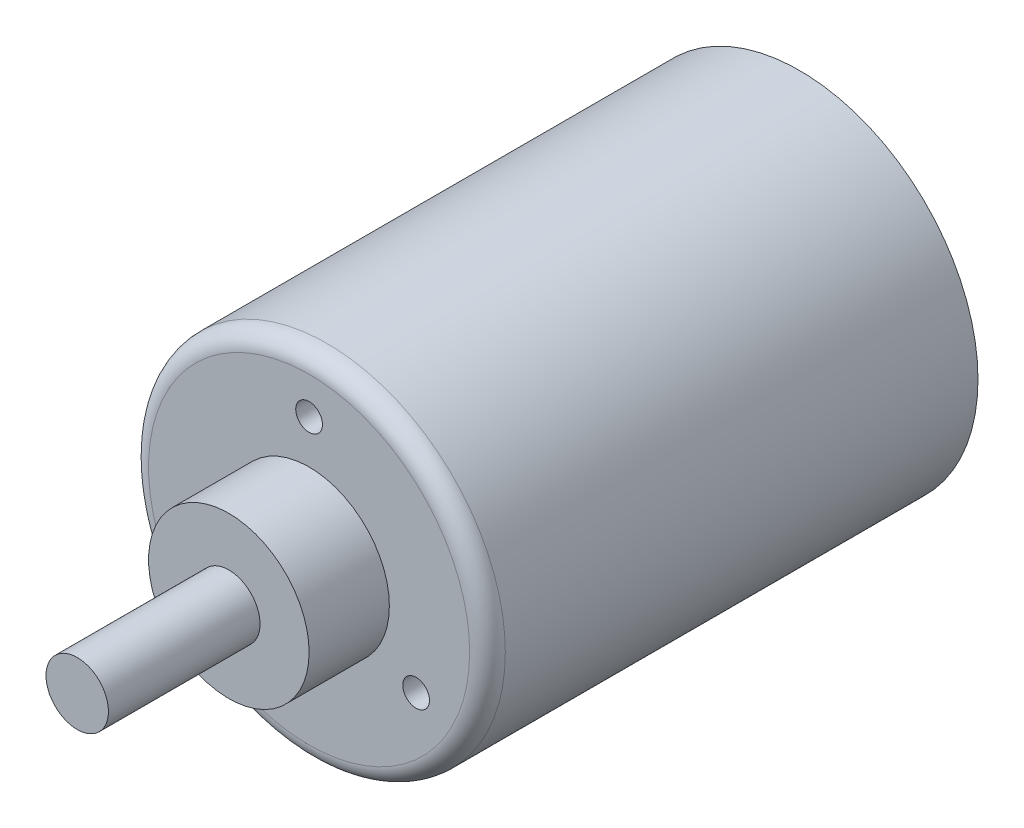
ISO-10303-21;
HEADER;
FILE_DESCRIPTION(('STEP AP214'),'2;1');
FILE_NAME('part.step','',(''),(''),'','','');
FILE_SCHEMA(('AUTOMOTIVE_DESIGN { 1 0 10303 214 1 1 1 1 }'));
ENDSEC;
DATA;
#1=APPLICATION_CONTEXT('core data for automotive mechanical design processes');
#2=APPLICATION_PROTOCOL_DEFINITION('international standard','automotive_design',2000,#1);
#3=PRODUCT_CONTEXT('',#1,'mechanical');
#4=PRODUCT('Part','Part','',(#3));
#5=PRODUCT_RELATED_PRODUCT_CATEGORY('part','',(#4));
#6=PRODUCT_DEFINITION_FORMATION('','',#4);
#7=PRODUCT_DEFINITION_CONTEXT('part definition',#1,'design');
#8=PRODUCT_DEFINITION('design','',#6,#7);
#9=PRODUCT_DEFINITION_SHAPE('','',#8);
#10=(LENGTH_UNIT() NAMED_UNIT(*) SI_UNIT(.MILLI.,.METRE.));
#11=(NAMED_UNIT(*) PLANE_ANGLE_UNIT() SI_UNIT($,.RADIAN.));
#12=(NAMED_UNIT(*) SI_UNIT($,.STERADIAN.) SOLID_ANGLE_UNIT());
#13=UNCERTAINTY_MEASURE_WITH_UNIT(LENGTH_MEASURE(1.E-05),#10,'distance_accuracy_value','');
#14=(GEOMETRIC_REPRESENTATION_CONTEXT(3) GLOBAL_UNCERTAINTY_ASSIGNED_CONTEXT((#13)) GLOBAL_UNIT_ASSIGNED_CONTEXT((#10,
#11,#12)) REPRESENTATION_CONTEXT('',''));
#15=CARTESIAN_POINT('',(0.,0.,0.));
#16=DIRECTION('',(0.,0.,1.));
#17=DIRECTION('',(1.,0.,0.));
#18=AXIS2_PLACEMENT_3D('',#15,#16,#17);
#19=CARTESIAN_POINT('',(0.,0.,55.));
#20=DIRECTION('',(0.,0.,-1.));
#21=DIRECTION('',(-1.,0.,0.));
#22=AXIS2_PLACEMENT_3D('',#19,#20,#21);
#23=CYLINDRICAL_SURFACE('',#22,20.);
#24=CARTESIAN_POINT('',(0.,0.,53.));
#25=DIRECTION('',(0.,0.,1.));
#26=DIRECTION('',(1.,0.,0.));
#27=AXIS2_PLACEMENT_3D('',#24,#25,#26);
#28=CIRCLE('',#27,20.);
#29=CARTESIAN_POINT('',(20.,0.,53.));
#30=VERTEX_POINT('',#29);
#31=EDGE_CURVE('E10',#30,#30,#28,.F.);
#32=ORIENTED_EDGE('',*,*,#31,.T.);
#33=EDGE_LOOP('',(#32));
#34=FACE_BOUND('',#33,.T.);
#35=CARTESIAN_POINT('',(0.,0.,0.));
#36=DIRECTION('',(0.,0.,1.));
#37=DIRECTION('',(1.,0.,0.));
#38=AXIS2_PLACEMENT_3D('',#35,#36,#37);
#39=CIRCLE('',#38,20.);
#40=CARTESIAN_POINT('',(20.,0.,0.));
#41=VERTEX_POINT('',#40);
#42=EDGE_CURVE('E61',#41,#41,#39,.T.);
#43=ORIENTED_EDGE('',*,*,#42,.T.);
#44=EDGE_LOOP('',(#43));
#45=FACE_BOUND('',#44,.T.);
#46=ADVANCED_FACE('F43',(#34,#45),#23,.T.);
#47=CARTESIAN_POINT('',(0.,0.,55.));
#48=DIRECTION('',(0.,0.,1.));
#49=DIRECTION('',(1.,0.,0.));
#50=AXIS2_PLACEMENT_3D('',#47,#48,#49);
#51=PLANE('',#50);
#52=CARTESIAN_POINT('',(0.,13.856406460551,55.));
#53=DIRECTION('',(0.,0.,1.));
#54=DIRECTION('',(1.,0.,0.));
#55=AXIS2_PLACEMENT_3D('',#52,#53,#54);
#56=CIRCLE('',#55,1.5);
#57=CARTESIAN_POINT('',(1.5,13.856406460551,55.));
#58=VERTEX_POINT('',#57);
#59=EDGE_CURVE('E104',#58,#58,#56,.T.);
#60=ORIENTED_EDGE('',*,*,#59,.F.);
#61=EDGE_LOOP('',(#60));
#62=FACE_BOUND('',#61,.T.);
#63=CARTESIAN_POINT('',(-12.,-6.92820323027556,55.));
#64=DIRECTION('',(0.,0.,1.));
#65=DIRECTION('',(1.,0.,0.));
#66=AXIS2_PLACEMENT_3D('',#63,#64,#65);
#67=CIRCLE('',#66,1.5);
#68=CARTESIAN_POINT('',(-10.5,-6.92820323027556,55.));
#69=VERTEX_POINT('',#68);
#70=EDGE_CURVE('E100',#69,#69,#67,.T.);
#71=ORIENTED_EDGE('',*,*,#70,.F.);
#72=EDGE_LOOP('',(#71));
#73=FACE_BOUND('',#72,.T.);
#74=CARTESIAN_POINT('',(12.,-6.92820323027538,55.));
#75=DIRECTION('',(0.,0.,1.));
#76=DIRECTION('',(1.,0.,0.));
#77=AXIS2_PLACEMENT_3D('',#74,#75,#76);
#78=CIRCLE('',#77,1.5);
#79=CARTESIAN_POINT('',(13.5,-6.92820323027538,55.));
#80=VERTEX_POINT('',#79);
#81=EDGE_CURVE('E92',#80,#80,#78,.T.);
#82=ORIENTED_EDGE('',*,*,#81,.F.);
#83=EDGE_LOOP('',(#82));
#84=FACE_BOUND('',#83,.T.);
#85=CARTESIAN_POINT('',(0.,0.,55.));
#86=DIRECTION('',(0.,0.,1.));
#87=DIRECTION('',(1.,0.,0.));
#88=AXIS2_PLACEMENT_3D('',#85,#86,#87);
#89=CIRCLE('',#88,18.);
#90=CARTESIAN_POINT('',(18.,0.,55.));
#91=VERTEX_POINT('',#90);
#92=EDGE_CURVE('E51',#91,#91,#89,.T.);
#93=ORIENTED_EDGE('',*,*,#92,.T.);
#94=EDGE_LOOP('',(#93));
#95=FACE_BOUND('',#94,.T.);
#96=CARTESIAN_POINT('',(0.,0.,55.));
#97=DIRECTION('',(0.,0.,1.));
#98=DIRECTION('',(1.,0.,0.));
#99=AXIS2_PLACEMENT_3D('',#96,#97,#98);
#100=CIRCLE('',#99,9.);
#101=CARTESIAN_POINT('',(9.,0.,55.));
#102=VERTEX_POINT('',#101);
#103=EDGE_CURVE('E56',#102,#102,#100,.T.);
#104=ORIENTED_EDGE('',*,*,#103,.F.);
#105=EDGE_LOOP('',(#104));
#106=FACE_BOUND('',#105,.T.);
#107=ADVANCED_FACE('F121',(#62,#73,#84,#95,#106),#51,.T.);
#108=CARTESIAN_POINT('',(0.,0.,0.));
#109=DIRECTION('',(0.,0.,1.));
#110=DIRECTION('',(1.,0.,0.));
#111=AXIS2_PLACEMENT_3D('',#108,#109,#110);
#112=PLANE('',#111);
#113=CARTESIAN_POINT('',(0.,0.,0.));
#114=DIRECTION('',(0.,0.,-1.));
#115=DIRECTION('',(-1.,0.,0.));
#116=AXIS2_PLACEMENT_3D('',#113,#114,#115);
#117=CIRCLE('',#116,17.);
#118=CARTESIAN_POINT('',(-17.,0.,0.));
#119=VERTEX_POINT('',#118);
#120=EDGE_CURVE('E80',#119,#119,#117,.T.);
#121=ORIENTED_EDGE('',*,*,#120,.F.);
#122=EDGE_LOOP('',(#121));
#123=FACE_BOUND('',#122,.T.);
#124=ORIENTED_EDGE('',*,*,#42,.F.);
#125=EDGE_LOOP('',(#124));
#126=FACE_BOUND('',#125,.T.);
#127=ADVANCED_FACE('F124',(#123,#126),#112,.F.);
#128=CARTESIAN_POINT('',(0.,0.,64.));
#129=DIRECTION('',(0.,0.,-1.));
#130=DIRECTION('',(-1.,0.,0.));
#131=AXIS2_PLACEMENT_3D('',#128,#129,#130);
#132=CYLINDRICAL_SURFACE('',#131,9.);
#133=CARTESIAN_POINT('',(0.,0.,64.));
#134=DIRECTION('',(0.,0.,1.));
#135=DIRECTION('',(1.,0.,0.));
#136=AXIS2_PLACEMENT_3D('',#133,#134,#135);
#137=CIRCLE('',#136,9.);
#138=CARTESIAN_POINT('',(9.,0.,64.));
#139=VERTEX_POINT('',#138);
#140=EDGE_CURVE('E66',#139,#139,#137,.T.);
#141=ORIENTED_EDGE('',*,*,#140,.F.);
#142=EDGE_LOOP('',(#141));
#143=FACE_BOUND('',#142,.T.);
#144=ORIENTED_EDGE('',*,*,#103,.T.);
#145=EDGE_LOOP('',(#144));
#146=FACE_BOUND('',#145,.T.);
#147=ADVANCED_FACE('F132',(#143,#146),#132,.T.);
#148=CARTESIAN_POINT('',(0.,0.,64.));
#149=DIRECTION('',(0.,0.,1.));
#150=DIRECTION('',(1.,0.,0.));
#151=AXIS2_PLACEMENT_3D('',#148,#149,#150);
#152=PLANE('',#151);
#153=CARTESIAN_POINT('',(0.,0.,64.));
#154=DIRECTION('',(0.,0.,1.));
#155=DIRECTION('',(1.,0.,0.));
#156=AXIS2_PLACEMENT_3D('',#153,#154,#155);
#157=CIRCLE('',#156,3.5);
#158=CARTESIAN_POINT('',(-3.5,0.,64.));
#159=VERTEX_POINT('',#158);
#160=EDGE_CURVE('E71',#159,#159,#157,.F.);
#161=ORIENTED_EDGE('',*,*,#160,.T.);
#162=EDGE_LOOP('',(#161));
#163=FACE_BOUND('',#162,.T.);
#164=ORIENTED_EDGE('',*,*,#140,.T.);
#165=EDGE_LOOP('',(#164));
#166=FACE_BOUND('',#165,.T.);
#167=ADVANCED_FACE('F134',(#163,#166),#152,.T.);
#168=CARTESIAN_POINT('',(0.,0.,81.));
#169=DIRECTION('',(0.,0.,-1.));
#170=DIRECTION('',(-1.,0.,0.));
#171=AXIS2_PLACEMENT_3D('',#168,#169,#170);
#172=CYLINDRICAL_SURFACE('',#171,3.5);
#173=CARTESIAN_POINT('',(0.,0.,81.));
#174=DIRECTION('',(0.,0.,1.));
#175=DIRECTION('',(1.,0.,0.));
#176=AXIS2_PLACEMENT_3D('',#173,#174,#175);
#177=CIRCLE('',#176,3.5);
#178=CARTESIAN_POINT('',(-3.5,0.,81.));
#179=VERTEX_POINT('',#178);
#180=EDGE_CURVE('E75',#179,#179,#177,.T.);
#181=CARTESIAN_POINT('',(-3.5,0.,64.));
#182=CARTESIAN_POINT('',(-3.5,0.,64.1770833333333));
#183=CARTESIAN_POINT('',(-3.5,0.,64.3541666666667));
#184=CARTESIAN_POINT('',(-3.5,0.,64.7083333333333));
#185=CARTESIAN_POINT('',(-3.5,0.,64.8854166666667));
#186=CARTESIAN_POINT('',(-3.5,0.,65.2395833333333));
#187=CARTESIAN_POINT('',(-3.5,0.,65.4166666666667));
#188=CARTESIAN_POINT('',(-3.5,0.,65.7708333333333));
#189=CARTESIAN_POINT('',(-3.5,0.,65.9479166666667));
#190=CARTESIAN_POINT('',(-3.5,0.,66.3020833333333));
#191=CARTESIAN_POINT('',(-3.5,0.,66.4791666666667));
#192=CARTESIAN_POINT('',(-3.5,0.,66.8333333333333));
#193=CARTESIAN_POINT('',(-3.5,0.,67.0104166666667));
#194=CARTESIAN_POINT('',(-3.5,0.,67.3645833333333));
#195=CARTESIAN_POINT('',(-3.5,0.,67.5416666666667));
#196=CARTESIAN_POINT('',(-3.5,0.,67.8958333333333));
#197=CARTESIAN_POINT('',(-3.5,0.,68.0729166666667));
#198=CARTESIAN_POINT('',(-3.5,0.,68.4270833333333));
#199=CARTESIAN_POINT('',(-3.5,0.,68.6041666666667));
#200=CARTESIAN_POINT('',(-3.5,0.,68.9583333333333));
#201=CARTESIAN_POINT('',(-3.5,0.,69.1354166666667));
#202=CARTESIAN_POINT('',(-3.5,0.,69.4895833333333));
#203=CARTESIAN_POINT('',(-3.5,0.,69.6666666666667));
#204=CARTESIAN_POINT('',(-3.5,0.,70.0208333333333));
#205=CARTESIAN_POINT('',(-3.5,0.,70.1979166666667));
#206=CARTESIAN_POINT('',(-3.5,0.,70.5520833333333));
#207=CARTESIAN_POINT('',(-3.5,0.,70.7291666666667));
#208=CARTESIAN_POINT('',(-3.5,0.,71.0833333333333));
#209=CARTESIAN_POINT('',(-3.5,0.,71.2604166666667));
#210=CARTESIAN_POINT('',(-3.5,0.,71.6145833333333));
#211=CARTESIAN_POINT('',(-3.5,0.,71.7916666666667));
#212=CARTESIAN_POINT('',(-3.5,0.,72.1458333333333));
#213=CARTESIAN_POINT('',(-3.5,0.,72.3229166666667));
#214=CARTESIAN_POINT('',(-3.5,0.,72.6770833333333));
#215=CARTESIAN_POINT('',(-3.5,0.,72.8541666666667));
#216=CARTESIAN_POINT('',(-3.5,0.,73.2083333333333));
#217=CARTESIAN_POINT('',(-3.5,0.,73.3854166666667));
#218=CARTESIAN_POINT('',(-3.5,0.,73.7395833333333));
#219=CARTESIAN_POINT('',(-3.5,0.,73.9166666666667));
#220=CARTESIAN_POINT('',(-3.5,0.,74.2708333333333));
#221=CARTESIAN_POINT('',(-3.5,0.,74.4479166666667));
#222=CARTESIAN_POINT('',(-3.5,0.,74.8020833333333));
#223=CARTESIAN_POINT('',(-3.5,0.,74.9791666666667));
#224=CARTESIAN_POINT('',(-3.5,0.,75.3333333333333));
#225=CARTESIAN_POINT('',(-3.5,0.,75.5104166666666));
#226=CARTESIAN_POINT('',(-3.5,0.,75.8645833333333));
#227=CARTESIAN_POINT('',(-3.5,0.,76.0416666666667));
#228=CARTESIAN_POINT('',(-3.5,0.,76.3958333333333));
#229=CARTESIAN_POINT('',(-3.5,0.,76.5729166666667));
#230=CARTESIAN_POINT('',(-3.5,0.,76.9270833333333));
#231=CARTESIAN_POINT('',(-3.5,0.,77.1041666666667));
#232=CARTESIAN_POINT('',(-3.5,0.,77.4583333333333));
#233=CARTESIAN_POINT('',(-3.5,0.,77.6354166666667));
#234=CARTESIAN_POINT('',(-3.5,0.,77.9895833333333));
#235=CARTESIAN_POINT('',(-3.5,0.,78.1666666666666));
#236=CARTESIAN_POINT('',(-3.5,0.,78.5208333333333));
#237=CARTESIAN_POINT('',(-3.5,0.,78.6979166666667));
#238=CARTESIAN_POINT('',(-3.5,0.,79.0520833333333));
#239=CARTESIAN_POINT('',(-3.5,0.,79.2291666666667));
#240=CARTESIAN_POINT('',(-3.5,0.,79.5833333333333));
#241=CARTESIAN_POINT('',(-3.5,0.,79.7604166666667));
#242=CARTESIAN_POINT('',(-3.5,0.,80.1145833333333));
#243=CARTESIAN_POINT('',(-3.5,0.,80.2916666666667));
#244=CARTESIAN_POINT('',(-3.5,0.,80.6458333333333));
#245=CARTESIAN_POINT('',(-3.5,0.,80.8229166666666));
#246=CARTESIAN_POINT('',(-3.5,0.,81.));
#247=B_SPLINE_CURVE_WITH_KNOTS('',3,(#181,#182,#183,#184,#185,#186,#187,#188,#189,#190,#191,
#192,#193,#194,#195,#196,#197,#198,#199,#200,#201,#202,#203,#204,#205,#206,#207,#208,#209,#210,
#211,#212,#213,#214,#215,#216,#217,#218,#219,#220,#221,#222,#223,#224,#225,#226,#227,#228,#229,
#230,#231,#232,#233,#234,#235,#236,#237,#238,#239,#240,#241,#242,#243,#244,#245,#246),
.UNSPECIFIED.,.F.,.F.,(4,2,2,2,2,2,2,2,2,2,2,2,2,2,2,2,2,2,2,2,2,2,2,2,2,2,2,2,2,2,2,2,4),(0.,
0.531249999999997,1.06250000000001,1.59375,2.125,2.65625,3.1875,3.71875000000001,4.25,4.78125,
5.3125,5.84374999999999,6.37500000000001,6.90625,7.4375,7.96875,8.49999999999999,
9.03125000000001,9.5625,10.09375,10.625,11.15625,11.6875,12.21875,12.75,13.28125,13.8125,
14.34375,14.875,15.40625,15.9375,16.46875,17.),.UNSPECIFIED.);
#248=EDGE_CURVE('BSEAM140',#159,#179,#247,.T.);
#249=ORIENTED_EDGE('',*,*,#160,.F.);
#250=ORIENTED_EDGE('',*,*,#180,.F.);
#251=ORIENTED_EDGE('',*,*,#248,.T.);
#252=ORIENTED_EDGE('',*,*,#248,.F.);
#253=EDGE_LOOP('',(#249,#251,#250,#252));
#254=FACE_BOUND('',#253,.T.);
#255=ADVANCED_FACE('F140',(#254),#172,.T.);
#256=CARTESIAN_POINT('',(0.,0.,81.));
#257=DIRECTION('',(0.,0.,1.));
#258=DIRECTION('',(1.,0.,0.));
#259=AXIS2_PLACEMENT_3D('',#256,#257,#258);
#260=PLANE('',#259);
#261=ORIENTED_EDGE('',*,*,#180,.T.);
#262=EDGE_LOOP('',(#261));
#263=FACE_BOUND('',#262,.T.);
#264=ADVANCED_FACE('F239',(#263),#260,.T.);
#265=CARTESIAN_POINT('',(0.,0.,3.));
#266=DIRECTION('',(0.,0.,-1.));
#267=DIRECTION('',(-1.,0.,0.));
#268=AXIS2_PLACEMENT_3D('',#265,#266,#267);
#269=CYLINDRICAL_SURFACE('',#268,17.);
#270=CARTESIAN_POINT('',(0.,0.,3.));
#271=DIRECTION('',(0.,0.,-1.));
#272=DIRECTION('',(-1.,0.,0.));
#273=AXIS2_PLACEMENT_3D('',#270,#271,#272);
#274=CIRCLE('',#273,17.);
#275=CARTESIAN_POINT('',(-17.,0.,3.));
#276=VERTEX_POINT('',#275);
#277=EDGE_CURVE('E79',#276,#276,#274,.T.);
#278=ORIENTED_EDGE('',*,*,#277,.F.);
#279=EDGE_LOOP('',(#278));
#280=FACE_BOUND('',#279,.T.);
#281=ORIENTED_EDGE('',*,*,#120,.T.);
#282=EDGE_LOOP('',(#281));
#283=FACE_BOUND('',#282,.T.);
#284=ADVANCED_FACE('F231',(#280,#283),#269,.F.);
#285=CARTESIAN_POINT('',(0.,0.,3.));
#286=DIRECTION('',(0.,0.,-1.));
#287=DIRECTION('',(-1.,0.,0.));
#288=AXIS2_PLACEMENT_3D('',#285,#286,#287);
#289=PLANE('',#288);
#290=ORIENTED_EDGE('',*,*,#277,.T.);
#291=EDGE_LOOP('',(#290));
#292=FACE_BOUND('',#291,.T.);
#293=ADVANCED_FACE('F159',(#292),#289,.T.);
#294=CARTESIAN_POINT('',(0.,0.,53.));
#295=DIRECTION('',(0.,0.,1.));
#296=DIRECTION('',(1.,0.,0.));
#297=AXIS2_PLACEMENT_3D('',#294,#295,#296);
#298=TOROIDAL_SURFACE('',#297,18.,2.);
#299=ORIENTED_EDGE('',*,*,#31,.F.);
#300=EDGE_LOOP('',(#299));
#301=FACE_BOUND('',#300,.T.);
#302=ORIENTED_EDGE('',*,*,#92,.F.);
#303=EDGE_LOOP('',(#302));
#304=FACE_BOUND('',#303,.T.);
#305=ADVANCED_FACE('F45',(#301,#304),#298,.T.);
#306=CARTESIAN_POINT('',(12.,-6.92820323027538,50.));
#307=DIRECTION('',(0.,0.,1.));
#308=DIRECTION('',(1.,0.,0.));
#309=AXIS2_PLACEMENT_3D('',#306,#307,#308);
#310=CYLINDRICAL_SURFACE('',#309,1.5);
#311=CARTESIAN_POINT('',(12.,-6.92820323027538,50.));
#312=DIRECTION('',(0.,0.,1.));
#313=DIRECTION('',(1.,0.,0.));
#314=AXIS2_PLACEMENT_3D('',#311,#312,#313);
#315=CIRCLE('',#314,1.5);
#316=CARTESIAN_POINT('',(13.5,-6.92820323027538,50.));
#317=VERTEX_POINT('',#316);
#318=EDGE_CURVE('E88',#317,#317,#315,.T.);
#319=ORIENTED_EDGE('',*,*,#318,.F.);
#320=EDGE_LOOP('',(#319));
#321=FACE_BOUND('',#320,.T.);
#322=ORIENTED_EDGE('',*,*,#81,.T.);
#323=EDGE_LOOP('',(#322));
#324=FACE_BOUND('',#323,.T.);
#325=ADVANCED_FACE('F165',(#321,#324),#310,.F.);
#326=CARTESIAN_POINT('',(12.,-6.92820323027538,50.));
#327=DIRECTION('',(0.,0.,1.));
#328=DIRECTION('',(1.,0.,0.));
#329=AXIS2_PLACEMENT_3D('',#326,#327,#328);
#330=PLANE('',#329);
#331=ORIENTED_EDGE('',*,*,#318,.T.);
#332=EDGE_LOOP('',(#331));
#333=FACE_BOUND('',#332,.T.);
#334=ADVANCED_FACE('F179',(#333),#330,.T.);
#335=CARTESIAN_POINT('',(-12.,-6.92820323027556,50.));
#336=DIRECTION('',(0.,0.,1.));
#337=DIRECTION('',(1.,0.,0.));
#338=AXIS2_PLACEMENT_3D('',#335,#336,#337);
#339=CYLINDRICAL_SURFACE('',#338,1.5);
#340=CARTESIAN_POINT('',(-12.,-6.92820323027556,50.));
#341=DIRECTION('',(0.,0.,1.));
#342=DIRECTION('',(1.,0.,0.));
#343=AXIS2_PLACEMENT_3D('',#340,#341,#342);
#344=CIRCLE('',#343,1.5);
#345=CARTESIAN_POINT('',(-10.5,-6.92820323027556,50.));
#346=VERTEX_POINT('',#345);
#347=EDGE_CURVE('E96',#346,#346,#344,.T.);
#348=ORIENTED_EDGE('',*,*,#347,.F.);
#349=EDGE_LOOP('',(#348));
#350=FACE_BOUND('',#349,.T.);
#351=ORIENTED_EDGE('',*,*,#70,.T.);
#352=EDGE_LOOP('',(#351));
#353=FACE_BOUND('',#352,.T.);
#354=ADVANCED_FACE('F188',(#350,#353),#339,.F.);
#355=CARTESIAN_POINT('',(-12.,-6.92820323027556,50.));
#356=DIRECTION('',(0.,0.,1.));
#357=DIRECTION('',(1.,0.,0.));
#358=AXIS2_PLACEMENT_3D('',#355,#356,#357);
#359=PLANE('',#358);
#360=ORIENTED_EDGE('',*,*,#347,.T.);
#361=EDGE_LOOP('',(#360));
#362=FACE_BOUND('',#361,.T.);
#363=ADVANCED_FACE('F117',(#362),#359,.T.);
#364=CARTESIAN_POINT('',(0.,13.856406460551,50.));
#365=DIRECTION('',(0.,0.,1.));
#366=DIRECTION('',(1.,0.,0.));
#367=AXIS2_PLACEMENT_3D('',#364,#365,#366);
#368=CYLINDRICAL_SURFACE('',#367,1.5);
#369=CARTESIAN_POINT('',(0.,13.856406460551,50.));
#370=DIRECTION('',(0.,0.,1.));
#371=DIRECTION('',(1.,0.,0.));
#372=AXIS2_PLACEMENT_3D('',#369,#370,#371);
#373=CIRCLE('',#372,1.5);
#374=CARTESIAN_POINT('',(1.5,13.856406460551,50.));
#375=VERTEX_POINT('',#374);
#376=EDGE_CURVE('E84',#375,#375,#373,.T.);
#377=ORIENTED_EDGE('',*,*,#376,.F.);
#378=EDGE_LOOP('',(#377));
#379=FACE_BOUND('',#378,.T.);
#380=ORIENTED_EDGE('',*,*,#59,.T.);
#381=EDGE_LOOP('',(#380));
#382=FACE_BOUND('',#381,.T.);
#383=ADVANCED_FACE('F114',(#379,#382),#368,.F.);
#384=CARTESIAN_POINT('',(0.,13.856406460551,50.));
#385=DIRECTION('',(0.,0.,1.));
#386=DIRECTION('',(1.,0.,0.));
#387=AXIS2_PLACEMENT_3D('',#384,#385,#386);
#388=PLANE('',#387);
#389=ORIENTED_EDGE('',*,*,#376,.T.);
#390=EDGE_LOOP('',(#389));
#391=FACE_BOUND('',#390,.T.);
#392=ADVANCED_FACE('F112',(#391),#388,.T.);
#393=CLOSED_SHELL('',(#46,#107,#127,#147,#167,#255,#264,#284,#293,#305,#325,#334,#354,#363,#383,#392));
#394=MANIFOLD_SOLID_BREP('B2',#393);
#395=ADVANCED_BREP_SHAPE_REPRESENTATION('',(#18,#394),#14);
#396=SHAPE_DEFINITION_REPRESENTATION(#9,#395);
ENDSEC;
END-ISO-10303-21;
